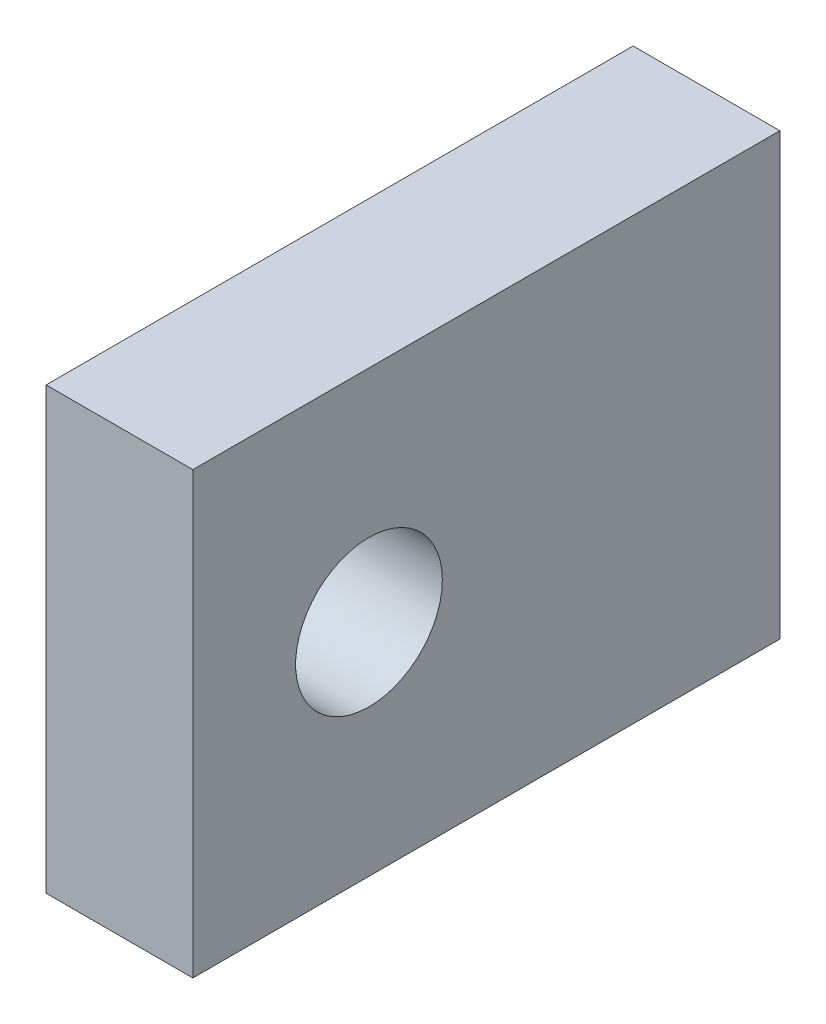
ISO-10303-21;
HEADER;
FILE_DESCRIPTION(('STEP AP214'),'2;1');
FILE_NAME('part.step','',(''),(''),'','','');
FILE_SCHEMA(('AUTOMOTIVE_DESIGN { 1 0 10303 214 1 1 1 1 }'));
ENDSEC;
DATA;
#1=APPLICATION_CONTEXT('core data for automotive mechanical design processes');
#2=APPLICATION_PROTOCOL_DEFINITION('international standard','automotive_design',2000,#1);
#3=PRODUCT_CONTEXT('',#1,'mechanical');
#4=PRODUCT('Part','Part','',(#3));
#5=PRODUCT_RELATED_PRODUCT_CATEGORY('part','',(#4));
#6=PRODUCT_DEFINITION_FORMATION('','',#4);
#7=PRODUCT_DEFINITION_CONTEXT('part definition',#1,'design');
#8=PRODUCT_DEFINITION('design','',#6,#7);
#9=PRODUCT_DEFINITION_SHAPE('','',#8);
#10=(LENGTH_UNIT() NAMED_UNIT(*) SI_UNIT(.MILLI.,.METRE.));
#11=(NAMED_UNIT(*) PLANE_ANGLE_UNIT() SI_UNIT($,.RADIAN.));
#12=(NAMED_UNIT(*) SI_UNIT($,.STERADIAN.) SOLID_ANGLE_UNIT());
#13=UNCERTAINTY_MEASURE_WITH_UNIT(LENGTH_MEASURE(1.E-05),#10,'distance_accuracy_value','');
#14=(GEOMETRIC_REPRESENTATION_CONTEXT(3) GLOBAL_UNCERTAINTY_ASSIGNED_CONTEXT((#13)) GLOBAL_UNIT_ASSIGNED_CONTEXT((#10,
#11,#12)) REPRESENTATION_CONTEXT('',''));
#15=CARTESIAN_POINT('',(0.,0.,0.));
#16=DIRECTION('',(0.,0.,1.));
#17=DIRECTION('',(1.,0.,0.));
#18=AXIS2_PLACEMENT_3D('',#15,#16,#17);
#19=CARTESIAN_POINT('',(12.7,0.,0.));
#20=DIRECTION('',(-1.,0.,0.));
#21=DIRECTION('',(0.,0.,1.));
#22=AXIS2_PLACEMENT_3D('',#19,#20,#21);
#23=PLANE('',#22);
#24=DIRECTION('',(0.,1.,0.));
#25=VECTOR('',#24,1.);
#26=CARTESIAN_POINT('',(12.7,-19.05,-25.4));
#27=LINE('',#26,#25);
#28=CARTESIAN_POINT('',(12.7,-19.05,-25.4));
#29=VERTEX_POINT('',#28);
#30=CARTESIAN_POINT('',(12.7,19.05,-25.4));
#31=VERTEX_POINT('',#30);
#32=EDGE_CURVE('E97',#29,#31,#27,.T.);
#33=ORIENTED_EDGE('',*,*,#32,.T.);
#34=DIRECTION('',(0.,0.,1.));
#35=VECTOR('',#34,1.);
#36=CARTESIAN_POINT('',(12.7,19.05,25.4));
#37=LINE('',#36,#35);
#38=CARTESIAN_POINT('',(12.7,19.05,25.4));
#39=VERTEX_POINT('',#38);
#40=EDGE_CURVE('E92',#31,#39,#37,.T.);
#41=ORIENTED_EDGE('',*,*,#40,.T.);
#42=DIRECTION('',(0.,-1.,0.));
#43=VECTOR('',#42,1.);
#44=CARTESIAN_POINT('',(12.7,-19.05,25.4));
#45=LINE('',#44,#43);
#46=CARTESIAN_POINT('',(12.7,-19.05,25.4));
#47=VERTEX_POINT('',#46);
#48=EDGE_CURVE('E95',#39,#47,#45,.T.);
#49=ORIENTED_EDGE('',*,*,#48,.T.);
#50=DIRECTION('',(0.,0.,-1.));
#51=VECTOR('',#50,1.);
#52=CARTESIAN_POINT('',(12.7,-19.05,25.4));
#53=LINE('',#52,#51);
#54=EDGE_CURVE('E62',#47,#29,#53,.T.);
#55=ORIENTED_EDGE('',*,*,#54,.T.);
#56=EDGE_LOOP('',(#33,#41,#49,#55));
#57=FACE_BOUND('',#56,.T.);
#58=CARTESIAN_POINT('',(12.7,0.,10.16));
#59=DIRECTION('',(1.,0.,0.));
#60=DIRECTION('',(0.,0.,-1.));
#61=AXIS2_PLACEMENT_3D('',#58,#59,#60);
#62=CIRCLE('',#61,6.35);
#63=CARTESIAN_POINT('',(12.7,0.,3.81000000000001));
#64=VERTEX_POINT('',#63);
#65=EDGE_CURVE('E112',#64,#64,#62,.T.);
#66=ORIENTED_EDGE('',*,*,#65,.F.);
#67=EDGE_LOOP('',(#66));
#68=FACE_BOUND('',#67,.T.);
#69=ADVANCED_FACE('F45',(#57,#68),#23,.F.);
#70=CARTESIAN_POINT('',(0.,0.,0.));
#71=DIRECTION('',(-1.,0.,0.));
#72=DIRECTION('',(0.,0.,1.));
#73=AXIS2_PLACEMENT_3D('',#70,#71,#72);
#74=PLANE('',#73);
#75=DIRECTION('',(0.,1.,0.));
#76=VECTOR('',#75,1.);
#77=CARTESIAN_POINT('',(0.,-19.05,-25.4));
#78=LINE('',#77,#76);
#79=CARTESIAN_POINT('',(0.,-19.05,-25.4));
#80=VERTEX_POINT('',#79);
#81=CARTESIAN_POINT('',(0.,19.05,-25.4));
#82=VERTEX_POINT('',#81);
#83=EDGE_CURVE('E109',#80,#82,#78,.T.);
#84=ORIENTED_EDGE('',*,*,#83,.F.);
#85=DIRECTION('',(0.,0.,-1.));
#86=VECTOR('',#85,1.);
#87=CARTESIAN_POINT('',(0.,-19.05,25.4));
#88=LINE('',#87,#86);
#89=CARTESIAN_POINT('',(0.,-19.05,25.4));
#90=VERTEX_POINT('',#89);
#91=EDGE_CURVE('E85',#90,#80,#88,.T.);
#92=ORIENTED_EDGE('',*,*,#91,.F.);
#93=DIRECTION('',(0.,-1.,0.));
#94=VECTOR('',#93,1.);
#95=CARTESIAN_POINT('',(0.,-19.05,25.4));
#96=LINE('',#95,#94);
#97=CARTESIAN_POINT('',(0.,19.05,25.4));
#98=VERTEX_POINT('',#97);
#99=EDGE_CURVE('E79',#98,#90,#96,.T.);
#100=ORIENTED_EDGE('',*,*,#99,.F.);
#101=DIRECTION('',(0.,0.,1.));
#102=VECTOR('',#101,1.);
#103=CARTESIAN_POINT('',(0.,19.05,25.4));
#104=LINE('',#103,#102);
#105=EDGE_CURVE('E101',#82,#98,#104,.T.);
#106=ORIENTED_EDGE('',*,*,#105,.F.);
#107=EDGE_LOOP('',(#84,#92,#100,#106));
#108=FACE_BOUND('',#107,.T.);
#109=CARTESIAN_POINT('',(0.,0.,10.16));
#110=DIRECTION('',(1.,0.,0.));
#111=DIRECTION('',(0.,0.,-1.));
#112=AXIS2_PLACEMENT_3D('',#109,#110,#111);
#113=CIRCLE('',#112,6.35);
#114=CARTESIAN_POINT('',(0.,0.,3.81000000000001));
#115=VERTEX_POINT('',#114);
#116=EDGE_CURVE('E124',#115,#115,#113,.T.);
#117=ORIENTED_EDGE('',*,*,#116,.T.);
#118=EDGE_LOOP('',(#117));
#119=FACE_BOUND('',#118,.T.);
#120=ADVANCED_FACE('F120',(#108,#119),#74,.T.);
#121=CARTESIAN_POINT('',(12.7,-19.05,-25.4));
#122=DIRECTION('',(0.,0.,1.));
#123=DIRECTION('',(1.,0.,0.));
#124=AXIS2_PLACEMENT_3D('',#121,#122,#123);
#125=PLANE('',#124);
#126=ORIENTED_EDGE('',*,*,#83,.T.);
#127=DIRECTION('',(-1.,0.,0.));
#128=VECTOR('',#127,1.);
#129=CARTESIAN_POINT('',(12.7,19.05,-25.4));
#130=LINE('',#129,#128);
#131=EDGE_CURVE('E13',#31,#82,#130,.T.);
#132=ORIENTED_EDGE('',*,*,#131,.F.);
#133=ORIENTED_EDGE('',*,*,#32,.F.);
#134=DIRECTION('',(-1.,0.,0.));
#135=VECTOR('',#134,1.);
#136=CARTESIAN_POINT('',(12.7,-19.05,-25.4));
#137=LINE('',#136,#135);
#138=EDGE_CURVE('E105',#29,#80,#137,.T.);
#139=ORIENTED_EDGE('',*,*,#138,.T.);
#140=EDGE_LOOP('',(#126,#132,#133,#139));
#141=FACE_BOUND('',#140,.T.);
#142=ADVANCED_FACE('F47',(#141),#125,.F.);
#143=CARTESIAN_POINT('',(12.7,19.05,25.4));
#144=DIRECTION('',(0.,-1.,0.));
#145=DIRECTION('',(0.,0.,-1.));
#146=AXIS2_PLACEMENT_3D('',#143,#144,#145);
#147=PLANE('',#146);
#148=ORIENTED_EDGE('',*,*,#105,.T.);
#149=DIRECTION('',(-1.,0.,0.));
#150=VECTOR('',#149,1.);
#151=CARTESIAN_POINT('',(12.7,19.05,25.4));
#152=LINE('',#151,#150);
#153=EDGE_CURVE('E54',#39,#98,#152,.T.);
#154=ORIENTED_EDGE('',*,*,#153,.F.);
#155=ORIENTED_EDGE('',*,*,#40,.F.);
#156=ORIENTED_EDGE('',*,*,#131,.T.);
#157=EDGE_LOOP('',(#148,#154,#155,#156));
#158=FACE_BOUND('',#157,.T.);
#159=ADVANCED_FACE('F100',(#158),#147,.F.);
#160=CARTESIAN_POINT('',(12.7,-19.05,25.4));
#161=DIRECTION('',(0.,0.,-1.));
#162=DIRECTION('',(-1.,0.,0.));
#163=AXIS2_PLACEMENT_3D('',#160,#161,#162);
#164=PLANE('',#163);
#165=ORIENTED_EDGE('',*,*,#99,.T.);
#166=DIRECTION('',(-1.,0.,0.));
#167=VECTOR('',#166,1.);
#168=CARTESIAN_POINT('',(12.7,-19.05,25.4));
#169=LINE('',#168,#167);
#170=EDGE_CURVE('E102',#47,#90,#169,.T.);
#171=ORIENTED_EDGE('',*,*,#170,.F.);
#172=ORIENTED_EDGE('',*,*,#48,.F.);
#173=ORIENTED_EDGE('',*,*,#153,.T.);
#174=EDGE_LOOP('',(#165,#171,#172,#173));
#175=FACE_BOUND('',#174,.T.);
#176=ADVANCED_FACE('F103',(#175),#164,.F.);
#177=CARTESIAN_POINT('',(12.7,-19.05,25.4));
#178=DIRECTION('',(0.,1.,0.));
#179=DIRECTION('',(0.,0.,1.));
#180=AXIS2_PLACEMENT_3D('',#177,#178,#179);
#181=PLANE('',#180);
#182=ORIENTED_EDGE('',*,*,#91,.T.);
#183=ORIENTED_EDGE('',*,*,#138,.F.);
#184=ORIENTED_EDGE('',*,*,#54,.F.);
#185=ORIENTED_EDGE('',*,*,#170,.T.);
#186=EDGE_LOOP('',(#182,#183,#184,#185));
#187=FACE_BOUND('',#186,.T.);
#188=ADVANCED_FACE('F117',(#187),#181,.F.);
#189=CARTESIAN_POINT('',(12.7,0.,10.16));
#190=DIRECTION('',(-1.,0.,0.));
#191=DIRECTION('',(0.,0.,1.));
#192=AXIS2_PLACEMENT_3D('',#189,#190,#191);
#193=CYLINDRICAL_SURFACE('',#192,6.35);
#194=ORIENTED_EDGE('',*,*,#65,.T.);
#195=EDGE_LOOP('',(#194));
#196=FACE_BOUND('',#195,.T.);
#197=ORIENTED_EDGE('',*,*,#116,.F.);
#198=EDGE_LOOP('',(#197));
#199=FACE_BOUND('',#198,.T.);
#200=ADVANCED_FACE('F130',(#196,#199),#193,.F.);
#201=CLOSED_SHELL('',(#69,#120,#142,#159,#176,#188,#200));
#202=MANIFOLD_SOLID_BREP('B2',#201);
#203=ADVANCED_BREP_SHAPE_REPRESENTATION('',(#18,#202),#14);
#204=SHAPE_DEFINITION_REPRESENTATION(#9,#203);
ENDSEC;
END-ISO-10303-21;
